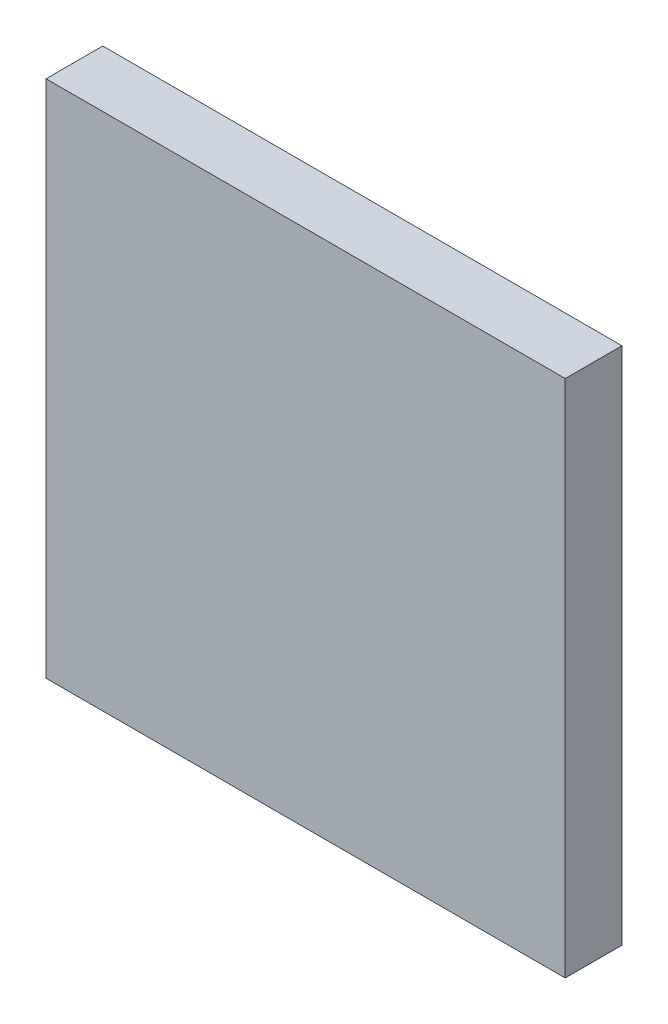
ISO-10303-21;
HEADER;
FILE_DESCRIPTION(('STEP AP214'),'2;1');
FILE_NAME('part.step','',(''),(''),'','','');
FILE_SCHEMA(('AUTOMOTIVE_DESIGN { 1 0 10303 214 1 1 1 1 }'));
ENDSEC;
DATA;
#1=APPLICATION_CONTEXT('core data for automotive mechanical design processes');
#2=APPLICATION_PROTOCOL_DEFINITION('international standard','automotive_design',2000,#1);
#3=PRODUCT_CONTEXT('',#1,'mechanical');
#4=PRODUCT('Part','Part','',(#3));
#5=PRODUCT_RELATED_PRODUCT_CATEGORY('part','',(#4));
#6=PRODUCT_DEFINITION_FORMATION('','',#4);
#7=PRODUCT_DEFINITION_CONTEXT('part definition',#1,'design');
#8=PRODUCT_DEFINITION('design','',#6,#7);
#9=PRODUCT_DEFINITION_SHAPE('','',#8);
#10=(LENGTH_UNIT() NAMED_UNIT(*) SI_UNIT(.MILLI.,.METRE.));
#11=(NAMED_UNIT(*) PLANE_ANGLE_UNIT() SI_UNIT($,.RADIAN.));
#12=(NAMED_UNIT(*) SI_UNIT($,.STERADIAN.) SOLID_ANGLE_UNIT());
#13=UNCERTAINTY_MEASURE_WITH_UNIT(LENGTH_MEASURE(1.E-05),#10,'distance_accuracy_value','');
#14=(GEOMETRIC_REPRESENTATION_CONTEXT(3) GLOBAL_UNCERTAINTY_ASSIGNED_CONTEXT((#13)) GLOBAL_UNIT_ASSIGNED_CONTEXT((#10,
#11,#12)) REPRESENTATION_CONTEXT('',''));
#15=CARTESIAN_POINT('',(0.,0.,0.));
#16=DIRECTION('',(0.,0.,1.));
#17=DIRECTION('',(1.,0.,0.));
#18=AXIS2_PLACEMENT_3D('',#15,#16,#17);
#19=CARTESIAN_POINT('',(4.57499974,4.57499974,1.00000054));
#20=DIRECTION('',(0.,0.,-1.));
#21=DIRECTION('',(-1.,0.,0.));
#22=AXIS2_PLACEMENT_3D('',#19,#20,#21);
#23=PLANE('',#22);
#24=DIRECTION('',(0.,1.,0.));
#25=VECTOR('',#24,1.);
#26=CARTESIAN_POINT('',(-4.57499974,4.57499974,1.00000054));
#27=LINE('',#26,#25);
#28=CARTESIAN_POINT('',(-4.57499974,4.57499974,1.00000054));
#29=VERTEX_POINT('',#28);
#30=CARTESIAN_POINT('',(-4.57499974,-4.57499974,1.00000054));
#31=VERTEX_POINT('',#30);
#32=EDGE_CURVE('E79',#29,#31,#27,.F.);
#33=ORIENTED_EDGE('',*,*,#32,.T.);
#34=DIRECTION('',(1.,0.,0.));
#35=VECTOR('',#34,1.);
#36=CARTESIAN_POINT('',(-4.57499974,-4.57499974,1.00000054));
#37=LINE('',#36,#35);
#38=CARTESIAN_POINT('',(4.57499974,-4.57499974,1.00000054));
#39=VERTEX_POINT('',#38);
#40=EDGE_CURVE('E55',#31,#39,#37,.T.);
#41=ORIENTED_EDGE('',*,*,#40,.T.);
#42=DIRECTION('',(0.,1.,0.));
#43=VECTOR('',#42,1.);
#44=CARTESIAN_POINT('',(4.57499974,-4.57499974,1.00000054));
#45=LINE('',#44,#43);
#46=CARTESIAN_POINT('',(4.57499974,4.57499974,1.00000054));
#47=VERTEX_POINT('',#46);
#48=EDGE_CURVE('E57',#39,#47,#45,.T.);
#49=ORIENTED_EDGE('',*,*,#48,.T.);
#50=DIRECTION('',(1.,0.,0.));
#51=VECTOR('',#50,1.);
#52=CARTESIAN_POINT('',(4.57499974,4.57499974,1.00000054));
#53=LINE('',#52,#51);
#54=EDGE_CURVE('E20',#47,#29,#53,.F.);
#55=ORIENTED_EDGE('',*,*,#54,.T.);
#56=EDGE_LOOP('',(#33,#41,#49,#55));
#57=FACE_BOUND('',#56,.T.);
#58=ADVANCED_FACE('F17',(#57),#23,.F.);
#59=CARTESIAN_POINT('',(4.57499974,4.57499974,0.));
#60=DIRECTION('',(0.,-1.,0.));
#61=DIRECTION('',(0.,0.,-1.));
#62=AXIS2_PLACEMENT_3D('',#59,#60,#61);
#63=PLANE('',#62);
#64=DIRECTION('',(-1.,0.,0.));
#65=VECTOR('',#64,1.);
#66=CARTESIAN_POINT('',(4.57499974,4.57499974,0.));
#67=LINE('',#66,#65);
#68=CARTESIAN_POINT('',(-4.57499974,4.57499974,0.));
#69=VERTEX_POINT('',#68);
#70=CARTESIAN_POINT('',(4.57499974,4.57499974,0.));
#71=VERTEX_POINT('',#70);
#72=EDGE_CURVE('E83',#69,#71,#67,.F.);
#73=ORIENTED_EDGE('',*,*,#72,.F.);
#74=DIRECTION('',(0.,0.,-1.));
#75=VECTOR('',#74,1.);
#76=CARTESIAN_POINT('',(-4.57499974,4.57499974,0.));
#77=LINE('',#76,#75);
#78=EDGE_CURVE('E68',#69,#29,#77,.F.);
#79=ORIENTED_EDGE('',*,*,#78,.T.);
#80=ORIENTED_EDGE('',*,*,#54,.F.);
#81=DIRECTION('',(0.,0.,1.));
#82=VECTOR('',#81,1.);
#83=CARTESIAN_POINT('',(4.57499974,4.57499974,0.));
#84=LINE('',#83,#82);
#85=EDGE_CURVE('E63',#47,#71,#84,.F.);
#86=ORIENTED_EDGE('',*,*,#85,.T.);
#87=EDGE_LOOP('',(#73,#79,#80,#86));
#88=FACE_BOUND('',#87,.T.);
#89=ADVANCED_FACE('F65',(#88),#63,.F.);
#90=CARTESIAN_POINT('',(4.57499974,-4.57499974,0.));
#91=DIRECTION('',(-1.,0.,0.));
#92=DIRECTION('',(0.,0.,1.));
#93=AXIS2_PLACEMENT_3D('',#90,#91,#92);
#94=PLANE('',#93);
#95=DIRECTION('',(0.,1.,0.));
#96=VECTOR('',#95,1.);
#97=CARTESIAN_POINT('',(4.57499974,4.57499974,0.));
#98=LINE('',#97,#96);
#99=CARTESIAN_POINT('',(4.57499974,-4.57499974,0.));
#100=VERTEX_POINT('',#99);
#101=EDGE_CURVE('E72',#71,#100,#98,.F.);
#102=ORIENTED_EDGE('',*,*,#101,.F.);
#103=ORIENTED_EDGE('',*,*,#85,.F.);
#104=ORIENTED_EDGE('',*,*,#48,.F.);
#105=DIRECTION('',(0.,0.,1.));
#106=VECTOR('',#105,1.);
#107=CARTESIAN_POINT('',(4.57499974,-4.57499974,0.));
#108=LINE('',#107,#106);
#109=EDGE_CURVE('E75',#39,#100,#108,.F.);
#110=ORIENTED_EDGE('',*,*,#109,.T.);
#111=EDGE_LOOP('',(#102,#103,#104,#110));
#112=FACE_BOUND('',#111,.T.);
#113=ADVANCED_FACE('F70',(#112),#94,.F.);
#114=CARTESIAN_POINT('',(-4.57499974,-4.57499974,0.));
#115=DIRECTION('',(0.,1.,0.));
#116=DIRECTION('',(0.,0.,1.));
#117=AXIS2_PLACEMENT_3D('',#114,#115,#116);
#118=PLANE('',#117);
#119=DIRECTION('',(-1.,0.,0.));
#120=VECTOR('',#119,1.);
#121=CARTESIAN_POINT('',(4.57499974,-4.57499974,0.));
#122=LINE('',#121,#120);
#123=CARTESIAN_POINT('',(-4.57499974,-4.57499974,0.));
#124=VERTEX_POINT('',#123);
#125=EDGE_CURVE('E26',#100,#124,#122,.T.);
#126=ORIENTED_EDGE('',*,*,#125,.F.);
#127=ORIENTED_EDGE('',*,*,#109,.F.);
#128=ORIENTED_EDGE('',*,*,#40,.F.);
#129=DIRECTION('',(0.,0.,-1.));
#130=VECTOR('',#129,1.);
#131=CARTESIAN_POINT('',(-4.57499974,-4.57499974,0.));
#132=LINE('',#131,#130);
#133=EDGE_CURVE('E35',#31,#124,#132,.T.);
#134=ORIENTED_EDGE('',*,*,#133,.T.);
#135=EDGE_LOOP('',(#126,#127,#128,#134));
#136=FACE_BOUND('',#135,.T.);
#137=ADVANCED_FACE('F89',(#136),#118,.F.);
#138=CARTESIAN_POINT('',(-4.57499974,4.57499974,0.));
#139=DIRECTION('',(1.,0.,0.));
#140=DIRECTION('',(0.,0.,-1.));
#141=AXIS2_PLACEMENT_3D('',#138,#139,#140);
#142=PLANE('',#141);
#143=DIRECTION('',(0.,1.,0.));
#144=VECTOR('',#143,1.);
#145=CARTESIAN_POINT('',(-4.57499974,4.57499974,0.));
#146=LINE('',#145,#144);
#147=EDGE_CURVE('E11',#124,#69,#146,.T.);
#148=ORIENTED_EDGE('',*,*,#147,.F.);
#149=ORIENTED_EDGE('',*,*,#133,.F.);
#150=ORIENTED_EDGE('',*,*,#32,.F.);
#151=ORIENTED_EDGE('',*,*,#78,.F.);
#152=EDGE_LOOP('',(#148,#149,#150,#151));
#153=FACE_BOUND('',#152,.T.);
#154=ADVANCED_FACE('F91',(#153),#142,.F.);
#155=CARTESIAN_POINT('',(4.57499974,4.57499974,0.));
#156=DIRECTION('',(0.,0.,-1.));
#157=DIRECTION('',(-1.,0.,0.));
#158=AXIS2_PLACEMENT_3D('',#155,#156,#157);
#159=PLANE('',#158);
#160=ORIENTED_EDGE('',*,*,#125,.T.);
#161=ORIENTED_EDGE('',*,*,#147,.T.);
#162=ORIENTED_EDGE('',*,*,#72,.T.);
#163=ORIENTED_EDGE('',*,*,#101,.T.);
#164=EDGE_LOOP('',(#160,#161,#162,#163));
#165=FACE_BOUND('',#164,.T.);
#166=ADVANCED_FACE('F88',(#165),#159,.T.);
#167=CLOSED_SHELL('',(#58,#89,#113,#137,#154,#166));
#168=MANIFOLD_SOLID_BREP('B1',#167);
#169=ADVANCED_BREP_SHAPE_REPRESENTATION('',(#18,#168),#14);
#170=SHAPE_DEFINITION_REPRESENTATION(#9,#169);
ENDSEC;
END-ISO-10303-21;
